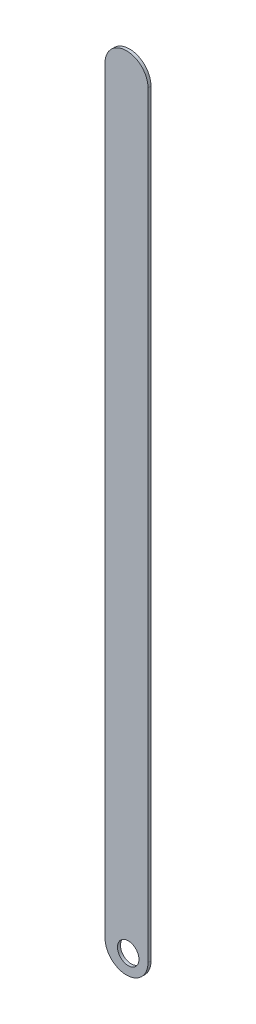
ISO-10303-21;
HEADER;
FILE_DESCRIPTION(('STEP AP214'),'2;1');
FILE_NAME('part.step','',(''),(''),'','','');
FILE_SCHEMA(('AUTOMOTIVE_DESIGN { 1 0 10303 214 1 1 1 1 }'));
ENDSEC;
DATA;
#1=APPLICATION_CONTEXT('core data for automotive mechanical design processes');
#2=APPLICATION_PROTOCOL_DEFINITION('international standard','automotive_design',2000,#1);
#3=PRODUCT_CONTEXT('',#1,'mechanical');
#4=PRODUCT('Part','Part','',(#3));
#5=PRODUCT_RELATED_PRODUCT_CATEGORY('part','',(#4));
#6=PRODUCT_DEFINITION_FORMATION('','',#4);
#7=PRODUCT_DEFINITION_CONTEXT('part definition',#1,'design');
#8=PRODUCT_DEFINITION('design','',#6,#7);
#9=PRODUCT_DEFINITION_SHAPE('','',#8);
#10=(LENGTH_UNIT() NAMED_UNIT(*) SI_UNIT(.MILLI.,.METRE.));
#11=(NAMED_UNIT(*) PLANE_ANGLE_UNIT() SI_UNIT($,.RADIAN.));
#12=(NAMED_UNIT(*) SI_UNIT($,.STERADIAN.) SOLID_ANGLE_UNIT());
#13=UNCERTAINTY_MEASURE_WITH_UNIT(LENGTH_MEASURE(1.E-05),#10,'distance_accuracy_value','');
#14=(GEOMETRIC_REPRESENTATION_CONTEXT(3) GLOBAL_UNCERTAINTY_ASSIGNED_CONTEXT((#13)) GLOBAL_UNIT_ASSIGNED_CONTEXT((#10,
#11,#12)) REPRESENTATION_CONTEXT('',''));
#15=CARTESIAN_POINT('',(0.,0.,0.));
#16=DIRECTION('',(0.,0.,1.));
#17=DIRECTION('',(1.,0.,0.));
#18=AXIS2_PLACEMENT_3D('',#15,#16,#17);
#19=CARTESIAN_POINT('',(102.3,-70.52,-0.045));
#20=DIRECTION('',(0.,0.,-1.));
#21=DIRECTION('',(0.,-1.,0.));
#22=AXIS2_PLACEMENT_3D('',#19,#20,#21);
#23=CYLINDRICAL_SURFACE('',#22,0.125);
#24=CARTESIAN_POINT('',(102.3,-70.52,1.6));
#25=DIRECTION('',(0.,0.,-1.));
#26=DIRECTION('',(0.,-1.,0.));
#27=AXIS2_PLACEMENT_3D('',#24,#25,#26);
#28=CIRCLE('',#27,0.125);
#29=CARTESIAN_POINT('',(102.3,-70.645,1.6));
#30=VERTEX_POINT('',#29);
#31=EDGE_CURVE('E73',#30,#30,#28,.T.);
#32=ORIENTED_EDGE('',*,*,#31,.T.);
#33=DIRECTION('',(0.,0.,1.));
#34=VECTOR('',#33,1.);
#35=CARTESIAN_POINT('',(102.3,-70.645,-0.045));
#36=LINE('',#35,#34);
#37=CARTESIAN_POINT('',(102.3,-70.645,1.635));
#38=VERTEX_POINT('',#37);
#39=EDGE_CURVE('E11',#30,#38,#36,.T.);
#40=ORIENTED_EDGE('',*,*,#39,.T.);
#41=CARTESIAN_POINT('',(102.3,-70.52,1.635));
#42=DIRECTION('',(0.,0.,-1.));
#43=DIRECTION('',(0.,-1.,0.));
#44=AXIS2_PLACEMENT_3D('',#41,#42,#43);
#45=CIRCLE('',#44,0.125);
#46=EDGE_CURVE('E27',#38,#38,#45,.T.);
#47=ORIENTED_EDGE('',*,*,#46,.F.);
#48=ORIENTED_EDGE('',*,*,#39,.F.);
#49=EDGE_LOOP('',(#32,#40,#47,#48));
#50=FACE_BOUND('',#49,.T.);
#51=ADVANCED_FACE('F17',(#50),#23,.F.);
#52=CARTESIAN_POINT('',(102.53,-70.5,1.6));
#53=DIRECTION('',(-1.,0.,0.));
#54=DIRECTION('',(0.,0.,1.));
#55=AXIS2_PLACEMENT_3D('',#52,#53,#54);
#56=PLANE('',#55);
#57=DIRECTION('',(0.,1.,0.));
#58=VECTOR('',#57,1.);
#59=CARTESIAN_POINT('',(102.53,-70.5,1.6));
#60=LINE('',#59,#58);
#61=CARTESIAN_POINT('',(102.53,-70.5,1.6));
#62=VERTEX_POINT('',#61);
#63=CARTESIAN_POINT('',(102.53,-61.69,1.6));
#64=VERTEX_POINT('',#63);
#65=EDGE_CURVE('E85',#62,#64,#60,.T.);
#66=ORIENTED_EDGE('',*,*,#65,.T.);
#67=DIRECTION('',(0.,0.,1.));
#68=VECTOR('',#67,1.);
#69=CARTESIAN_POINT('',(102.53,-61.69,1.6));
#70=LINE('',#69,#68);
#71=CARTESIAN_POINT('',(102.53,-61.69,1.635));
#72=VERTEX_POINT('',#71);
#73=EDGE_CURVE('E68',#64,#72,#70,.T.);
#74=ORIENTED_EDGE('',*,*,#73,.T.);
#75=DIRECTION('',(0.,1.,0.));
#76=VECTOR('',#75,1.);
#77=CARTESIAN_POINT('',(102.53,-70.5,1.635));
#78=LINE('',#77,#76);
#79=CARTESIAN_POINT('',(102.53,-70.5,1.635));
#80=VERTEX_POINT('',#79);
#81=EDGE_CURVE('E20',#80,#72,#78,.T.);
#82=ORIENTED_EDGE('',*,*,#81,.F.);
#83=DIRECTION('',(0.,0.,1.));
#84=VECTOR('',#83,1.);
#85=CARTESIAN_POINT('',(102.53,-70.5,1.6));
#86=LINE('',#85,#84);
#87=EDGE_CURVE('E65',#62,#80,#86,.T.);
#88=ORIENTED_EDGE('',*,*,#87,.F.);
#89=EDGE_LOOP('',(#66,#74,#82,#88));
#90=FACE_BOUND('',#89,.T.);
#91=ADVANCED_FACE('F63',(#90),#56,.F.);
#92=CARTESIAN_POINT('',(102.03,-61.69,1.635));
#93=DIRECTION('',(0.,0.,1.));
#94=DIRECTION('',(1.,0.,0.));
#95=AXIS2_PLACEMENT_3D('',#92,#93,#94);
#96=PLANE('',#95);
#97=ORIENTED_EDGE('',*,*,#46,.T.);
#98=EDGE_LOOP('',(#97));
#99=FACE_BOUND('',#98,.T.);
#100=DIRECTION('',(0.,-1.,0.));
#101=VECTOR('',#100,1.);
#102=CARTESIAN_POINT('',(102.03,-61.69,1.635));
#103=LINE('',#102,#101);
#104=CARTESIAN_POINT('',(102.03,-61.69,1.635));
#105=VERTEX_POINT('',#104);
#106=CARTESIAN_POINT('',(102.03,-70.5,1.635));
#107=VERTEX_POINT('',#106);
#108=EDGE_CURVE('E80',#105,#107,#103,.T.);
#109=ORIENTED_EDGE('',*,*,#108,.T.);
#110=CARTESIAN_POINT('',(102.28,-70.5,1.635));
#111=DIRECTION('',(0.,0.,1.));
#112=DIRECTION('',(-1.,0.,0.));
#113=AXIS2_PLACEMENT_3D('',#110,#111,#112);
#114=CIRCLE('',#113,0.25);
#115=EDGE_CURVE('E76',#107,#80,#114,.T.);
#116=ORIENTED_EDGE('',*,*,#115,.T.);
#117=ORIENTED_EDGE('',*,*,#81,.T.);
#118=CARTESIAN_POINT('',(102.28,-61.69,1.635));
#119=DIRECTION('',(0.,0.,1.));
#120=DIRECTION('',(1.,0.,0.));
#121=AXIS2_PLACEMENT_3D('',#118,#119,#120);
#122=CIRCLE('',#121,0.25);
#123=EDGE_CURVE('E120',#72,#105,#122,.T.);
#124=ORIENTED_EDGE('',*,*,#123,.T.);
#125=EDGE_LOOP('',(#109,#116,#117,#124));
#126=FACE_BOUND('',#125,.T.);
#127=ADVANCED_FACE('F77',(#99,#126),#96,.T.);
#128=CARTESIAN_POINT('',(102.03,-61.69,1.6));
#129=DIRECTION('',(0.,0.,1.));
#130=DIRECTION('',(1.,0.,0.));
#131=AXIS2_PLACEMENT_3D('',#128,#129,#130);
#132=PLANE('',#131);
#133=ORIENTED_EDGE('',*,*,#31,.F.);
#134=EDGE_LOOP('',(#133));
#135=FACE_BOUND('',#134,.T.);
#136=CARTESIAN_POINT('',(102.28,-61.69,1.6));
#137=DIRECTION('',(0.,0.,1.));
#138=DIRECTION('',(1.,0.,0.));
#139=AXIS2_PLACEMENT_3D('',#136,#137,#138);
#140=CIRCLE('',#139,0.25);
#141=CARTESIAN_POINT('',(102.03,-61.69,1.6));
#142=VERTEX_POINT('',#141);
#143=EDGE_CURVE('E116',#64,#142,#140,.T.);
#144=ORIENTED_EDGE('',*,*,#143,.F.);
#145=ORIENTED_EDGE('',*,*,#65,.F.);
#146=CARTESIAN_POINT('',(102.28,-70.5,1.6));
#147=DIRECTION('',(0.,0.,1.));
#148=DIRECTION('',(-1.,0.,0.));
#149=AXIS2_PLACEMENT_3D('',#146,#147,#148);
#150=CIRCLE('',#149,0.25);
#151=CARTESIAN_POINT('',(102.03,-70.5,1.6));
#152=VERTEX_POINT('',#151);
#153=EDGE_CURVE('E89',#152,#62,#150,.T.);
#154=ORIENTED_EDGE('',*,*,#153,.F.);
#155=DIRECTION('',(0.,-1.,0.));
#156=VECTOR('',#155,1.);
#157=CARTESIAN_POINT('',(102.03,-61.69,1.6));
#158=LINE('',#157,#156);
#159=EDGE_CURVE('E108',#142,#152,#158,.T.);
#160=ORIENTED_EDGE('',*,*,#159,.F.);
#161=EDGE_LOOP('',(#144,#145,#154,#160));
#162=FACE_BOUND('',#161,.T.);
#163=ADVANCED_FACE('F164',(#135,#162),#132,.F.);
#164=CARTESIAN_POINT('',(102.28,-70.5,1.6));
#165=DIRECTION('',(0.,0.,-1.));
#166=DIRECTION('',(-1.,0.,0.));
#167=AXIS2_PLACEMENT_3D('',#164,#165,#166);
#168=CYLINDRICAL_SURFACE('',#167,0.25);
#169=ORIENTED_EDGE('',*,*,#153,.T.);
#170=ORIENTED_EDGE('',*,*,#87,.T.);
#171=ORIENTED_EDGE('',*,*,#115,.F.);
#172=DIRECTION('',(0.,0.,1.));
#173=VECTOR('',#172,1.);
#174=CARTESIAN_POINT('',(102.03,-70.5,1.6));
#175=LINE('',#174,#173);
#176=EDGE_CURVE('E110',#152,#107,#175,.T.);
#177=ORIENTED_EDGE('',*,*,#176,.F.);
#178=EDGE_LOOP('',(#169,#170,#171,#177));
#179=FACE_BOUND('',#178,.T.);
#180=ADVANCED_FACE('F87',(#179),#168,.T.);
#181=CARTESIAN_POINT('',(102.28,-61.69,1.6));
#182=DIRECTION('',(0.,0.,-1.));
#183=DIRECTION('',(1.,0.,0.));
#184=AXIS2_PLACEMENT_3D('',#181,#182,#183);
#185=CYLINDRICAL_SURFACE('',#184,0.25);
#186=ORIENTED_EDGE('',*,*,#143,.T.);
#187=DIRECTION('',(0.,0.,1.));
#188=VECTOR('',#187,1.);
#189=CARTESIAN_POINT('',(102.03,-61.69,1.6));
#190=LINE('',#189,#188);
#191=EDGE_CURVE('E115',#142,#105,#190,.T.);
#192=ORIENTED_EDGE('',*,*,#191,.T.);
#193=ORIENTED_EDGE('',*,*,#123,.F.);
#194=ORIENTED_EDGE('',*,*,#73,.F.);
#195=EDGE_LOOP('',(#186,#192,#193,#194));
#196=FACE_BOUND('',#195,.T.);
#197=ADVANCED_FACE('F174',(#196),#185,.T.);
#198=CARTESIAN_POINT('',(102.03,-61.69,1.6));
#199=DIRECTION('',(1.,0.,0.));
#200=DIRECTION('',(0.,1.,0.));
#201=AXIS2_PLACEMENT_3D('',#198,#199,#200);
#202=PLANE('',#201);
#203=ORIENTED_EDGE('',*,*,#159,.T.);
#204=ORIENTED_EDGE('',*,*,#176,.T.);
#205=ORIENTED_EDGE('',*,*,#108,.F.);
#206=ORIENTED_EDGE('',*,*,#191,.F.);
#207=EDGE_LOOP('',(#203,#204,#205,#206));
#208=FACE_BOUND('',#207,.T.);
#209=ADVANCED_FACE('F159',(#208),#202,.F.);
#210=CLOSED_SHELL('',(#51,#91,#127,#163,#180,#197,#209));
#211=MANIFOLD_SOLID_BREP('B1',#210);
#212=ADVANCED_BREP_SHAPE_REPRESENTATION('',(#18,#211),#14);
#213=SHAPE_DEFINITION_REPRESENTATION(#9,#212);
ENDSEC;
END-ISO-10303-21;
